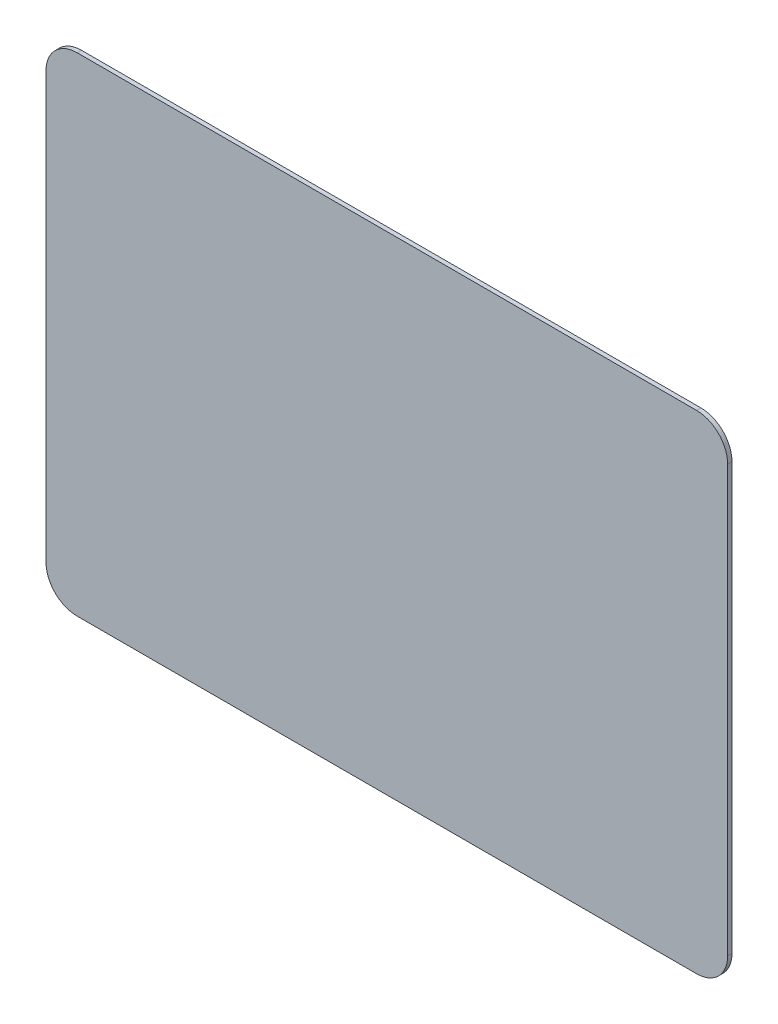
ISO-10303-21;
HEADER;
FILE_DESCRIPTION(('STEP AP214'),'2;1');
FILE_NAME('part.step','',(''),(''),'','','');
FILE_SCHEMA(('AUTOMOTIVE_DESIGN { 1 0 10303 214 1 1 1 1 }'));
ENDSEC;
DATA;
#1=APPLICATION_CONTEXT('core data for automotive mechanical design processes');
#2=APPLICATION_PROTOCOL_DEFINITION('international standard','automotive_design',2000,#1);
#3=PRODUCT_CONTEXT('',#1,'mechanical');
#4=PRODUCT('Part','Part','',(#3));
#5=PRODUCT_RELATED_PRODUCT_CATEGORY('part','',(#4));
#6=PRODUCT_DEFINITION_FORMATION('','',#4);
#7=PRODUCT_DEFINITION_CONTEXT('part definition',#1,'design');
#8=PRODUCT_DEFINITION('design','',#6,#7);
#9=PRODUCT_DEFINITION_SHAPE('','',#8);
#10=(LENGTH_UNIT() NAMED_UNIT(*) SI_UNIT(.MILLI.,.METRE.));
#11=(NAMED_UNIT(*) PLANE_ANGLE_UNIT() SI_UNIT($,.RADIAN.));
#12=(NAMED_UNIT(*) SI_UNIT($,.STERADIAN.) SOLID_ANGLE_UNIT());
#13=UNCERTAINTY_MEASURE_WITH_UNIT(LENGTH_MEASURE(1.E-05),#10,'distance_accuracy_value','');
#14=(GEOMETRIC_REPRESENTATION_CONTEXT(3) GLOBAL_UNCERTAINTY_ASSIGNED_CONTEXT((#13)) GLOBAL_UNIT_ASSIGNED_CONTEXT((#10,
#11,#12)) REPRESENTATION_CONTEXT('',''));
#15=CARTESIAN_POINT('',(0.,0.,0.));
#16=DIRECTION('',(0.,0.,1.));
#17=DIRECTION('',(1.,0.,0.));
#18=AXIS2_PLACEMENT_3D('',#15,#16,#17);
#19=CARTESIAN_POINT('',(-177.403473857814,-128.60424043732,2.286));
#20=DIRECTION('',(0.,0.,-1.));
#21=DIRECTION('',(-1.,0.,0.));
#22=AXIS2_PLACEMENT_3D('',#19,#20,#21);
#23=CYLINDRICAL_SURFACE('',#22,16.51);
#24=CARTESIAN_POINT('',(-177.403473857814,-128.60424043732,0.));
#25=DIRECTION('',(0.,0.,1.));
#26=DIRECTION('',(1.,0.,0.));
#27=AXIS2_PLACEMENT_3D('',#24,#25,#26);
#28=CIRCLE('',#27,16.51);
#29=CARTESIAN_POINT('',(-193.913473857814,-128.60424043732,0.));
#30=VERTEX_POINT('',#29);
#31=CARTESIAN_POINT('',(-177.403473857814,-145.11424043732,0.));
#32=VERTEX_POINT('',#31);
#33=EDGE_CURVE('E131',#30,#32,#28,.T.);
#34=ORIENTED_EDGE('',*,*,#33,.T.);
#35=DIRECTION('',(0.,0.,-1.));
#36=VECTOR('',#35,1.);
#37=CARTESIAN_POINT('',(-177.403473857814,-145.11424043732,2.286));
#38=LINE('',#37,#36);
#39=CARTESIAN_POINT('',(-177.403473857814,-145.11424043732,2.286));
#40=VERTEX_POINT('',#39);
#41=EDGE_CURVE('E11',#40,#32,#38,.T.);
#42=ORIENTED_EDGE('',*,*,#41,.F.);
#43=CARTESIAN_POINT('',(-177.403473857814,-128.60424043732,2.286));
#44=DIRECTION('',(0.,0.,1.));
#45=DIRECTION('',(1.,0.,0.));
#46=AXIS2_PLACEMENT_3D('',#43,#44,#45);
#47=CIRCLE('',#46,16.51);
#48=CARTESIAN_POINT('',(-193.913473857814,-128.60424043732,2.286));
#49=VERTEX_POINT('',#48);
#50=EDGE_CURVE('E145',#49,#40,#47,.T.);
#51=ORIENTED_EDGE('',*,*,#50,.F.);
#52=DIRECTION('',(0.,0.,-1.));
#53=VECTOR('',#52,1.);
#54=CARTESIAN_POINT('',(-193.913473857814,-128.60424043732,2.286));
#55=LINE('',#54,#53);
#56=EDGE_CURVE('E127',#49,#30,#55,.T.);
#57=ORIENTED_EDGE('',*,*,#56,.T.);
#58=EDGE_LOOP('',(#34,#42,#51,#57));
#59=FACE_BOUND('',#58,.T.);
#60=ADVANCED_FACE('F35',(#59),#23,.T.);
#61=CARTESIAN_POINT('',(-177.403473857814,-145.11424043732,2.286));
#62=DIRECTION('',(0.,1.,0.));
#63=DIRECTION('',(0.,0.,1.));
#64=AXIS2_PLACEMENT_3D('',#61,#62,#63);
#65=PLANE('',#64);
#66=DIRECTION('',(1.,0.,0.));
#67=VECTOR('',#66,1.);
#68=CARTESIAN_POINT('',(-177.403473857814,-145.11424043732,0.));
#69=LINE('',#68,#67);
#70=CARTESIAN_POINT('',(151.526526142186,-145.11424043732,0.));
#71=VERTEX_POINT('',#70);
#72=EDGE_CURVE('E134',#32,#71,#69,.T.);
#73=ORIENTED_EDGE('',*,*,#72,.T.);
#74=DIRECTION('',(0.,0.,-1.));
#75=VECTOR('',#74,1.);
#76=CARTESIAN_POINT('',(151.526526142186,-145.11424043732,2.286));
#77=LINE('',#76,#75);
#78=CARTESIAN_POINT('',(151.526526142186,-145.11424043732,2.286));
#79=VERTEX_POINT('',#78);
#80=EDGE_CURVE('E43',#79,#71,#77,.T.);
#81=ORIENTED_EDGE('',*,*,#80,.F.);
#82=DIRECTION('',(1.,0.,0.));
#83=VECTOR('',#82,1.);
#84=CARTESIAN_POINT('',(-177.403473857814,-145.11424043732,2.286));
#85=LINE('',#84,#83);
#86=EDGE_CURVE('E94',#40,#79,#85,.T.);
#87=ORIENTED_EDGE('',*,*,#86,.F.);
#88=ORIENTED_EDGE('',*,*,#41,.T.);
#89=EDGE_LOOP('',(#73,#81,#87,#88));
#90=FACE_BOUND('',#89,.T.);
#91=ADVANCED_FACE('F180',(#90),#65,.F.);
#92=CARTESIAN_POINT('',(151.526526142186,-128.60424043732,2.286));
#93=DIRECTION('',(0.,0.,-1.));
#94=DIRECTION('',(-1.,0.,0.));
#95=AXIS2_PLACEMENT_3D('',#92,#93,#94);
#96=CYLINDRICAL_SURFACE('',#95,16.51);
#97=CARTESIAN_POINT('',(151.526526142186,-128.60424043732,0.));
#98=DIRECTION('',(0.,0.,1.));
#99=DIRECTION('',(1.,0.,0.));
#100=AXIS2_PLACEMENT_3D('',#97,#98,#99);
#101=CIRCLE('',#100,16.51);
#102=CARTESIAN_POINT('',(168.036526142186,-128.60424043732,0.));
#103=VERTEX_POINT('',#102);
#104=EDGE_CURVE('E136',#71,#103,#101,.T.);
#105=ORIENTED_EDGE('',*,*,#104,.T.);
#106=DIRECTION('',(0.,0.,-1.));
#107=VECTOR('',#106,1.);
#108=CARTESIAN_POINT('',(168.036526142186,-128.60424043732,2.286));
#109=LINE('',#108,#107);
#110=CARTESIAN_POINT('',(168.036526142186,-128.60424043732,2.286));
#111=VERTEX_POINT('',#110);
#112=EDGE_CURVE('E152',#111,#103,#109,.T.);
#113=ORIENTED_EDGE('',*,*,#112,.F.);
#114=CARTESIAN_POINT('',(151.526526142186,-128.60424043732,2.286));
#115=DIRECTION('',(0.,0.,1.));
#116=DIRECTION('',(1.,0.,0.));
#117=AXIS2_PLACEMENT_3D('',#114,#115,#116);
#118=CIRCLE('',#117,16.51);
#119=EDGE_CURVE('E160',#79,#111,#118,.T.);
#120=ORIENTED_EDGE('',*,*,#119,.F.);
#121=ORIENTED_EDGE('',*,*,#80,.T.);
#122=EDGE_LOOP('',(#105,#113,#120,#121));
#123=FACE_BOUND('',#122,.T.);
#124=ADVANCED_FACE('F158',(#123),#96,.T.);
#125=CARTESIAN_POINT('',(168.036526142186,-128.60424043732,2.286));
#126=DIRECTION('',(-1.,0.,0.));
#127=DIRECTION('',(0.,0.,1.));
#128=AXIS2_PLACEMENT_3D('',#125,#126,#127);
#129=PLANE('',#128);
#130=DIRECTION('',(0.,1.,0.));
#131=VECTOR('',#130,1.);
#132=CARTESIAN_POINT('',(168.036526142186,-128.60424043732,0.));
#133=LINE('',#132,#131);
#134=CARTESIAN_POINT('',(168.036526142186,97.4557595626803,0.));
#135=VERTEX_POINT('',#134);
#136=EDGE_CURVE('E138',#103,#135,#133,.T.);
#137=ORIENTED_EDGE('',*,*,#136,.T.);
#138=DIRECTION('',(0.,0.,-1.));
#139=VECTOR('',#138,1.);
#140=CARTESIAN_POINT('',(168.036526142186,97.4557595626803,2.286));
#141=LINE('',#140,#139);
#142=CARTESIAN_POINT('',(168.036526142186,97.4557595626803,2.286));
#143=VERTEX_POINT('',#142);
#144=EDGE_CURVE('E149',#143,#135,#141,.T.);
#145=ORIENTED_EDGE('',*,*,#144,.F.);
#146=DIRECTION('',(0.,1.,0.));
#147=VECTOR('',#146,1.);
#148=CARTESIAN_POINT('',(168.036526142186,-128.60424043732,2.286));
#149=LINE('',#148,#147);
#150=EDGE_CURVE('E172',#111,#143,#149,.T.);
#151=ORIENTED_EDGE('',*,*,#150,.F.);
#152=ORIENTED_EDGE('',*,*,#112,.T.);
#153=EDGE_LOOP('',(#137,#145,#151,#152));
#154=FACE_BOUND('',#153,.T.);
#155=ADVANCED_FACE('F168',(#154),#129,.F.);
#156=CARTESIAN_POINT('',(151.526526142186,97.4557595626803,2.286));
#157=DIRECTION('',(0.,0.,-1.));
#158=DIRECTION('',(-1.,0.,0.));
#159=AXIS2_PLACEMENT_3D('',#156,#157,#158);
#160=CYLINDRICAL_SURFACE('',#159,16.51);
#161=CARTESIAN_POINT('',(151.526526142186,97.4557595626803,0.));
#162=DIRECTION('',(0.,0.,1.));
#163=DIRECTION('',(1.,0.,0.));
#164=AXIS2_PLACEMENT_3D('',#161,#162,#163);
#165=CIRCLE('',#164,16.51);
#166=CARTESIAN_POINT('',(151.526526142186,113.96575956268,0.));
#167=VERTEX_POINT('',#166);
#168=EDGE_CURVE('E140',#135,#167,#165,.T.);
#169=ORIENTED_EDGE('',*,*,#168,.T.);
#170=DIRECTION('',(0.,0.,-1.));
#171=VECTOR('',#170,1.);
#172=CARTESIAN_POINT('',(151.526526142186,113.96575956268,2.286));
#173=LINE('',#172,#171);
#174=CARTESIAN_POINT('',(151.526526142186,113.96575956268,2.286));
#175=VERTEX_POINT('',#174);
#176=EDGE_CURVE('E122',#175,#167,#173,.T.);
#177=ORIENTED_EDGE('',*,*,#176,.F.);
#178=CARTESIAN_POINT('',(151.526526142186,97.4557595626803,2.286));
#179=DIRECTION('',(0.,0.,1.));
#180=DIRECTION('',(1.,0.,0.));
#181=AXIS2_PLACEMENT_3D('',#178,#179,#180);
#182=CIRCLE('',#181,16.51);
#183=EDGE_CURVE('E113',#143,#175,#182,.T.);
#184=ORIENTED_EDGE('',*,*,#183,.F.);
#185=ORIENTED_EDGE('',*,*,#144,.T.);
#186=EDGE_LOOP('',(#169,#177,#184,#185));
#187=FACE_BOUND('',#186,.T.);
#188=ADVANCED_FACE('F171',(#187),#160,.T.);
#189=CARTESIAN_POINT('',(-177.403473857814,113.96575956268,2.286));
#190=DIRECTION('',(0.,-1.,0.));
#191=DIRECTION('',(0.,0.,-1.));
#192=AXIS2_PLACEMENT_3D('',#189,#190,#191);
#193=PLANE('',#192);
#194=DIRECTION('',(-1.,0.,0.));
#195=VECTOR('',#194,1.);
#196=CARTESIAN_POINT('',(-177.403473857814,113.96575956268,0.));
#197=LINE('',#196,#195);
#198=CARTESIAN_POINT('',(-177.403473857814,113.96575956268,0.));
#199=VERTEX_POINT('',#198);
#200=EDGE_CURVE('E121',#167,#199,#197,.T.);
#201=ORIENTED_EDGE('',*,*,#200,.T.);
#202=DIRECTION('',(0.,0.,-1.));
#203=VECTOR('',#202,1.);
#204=CARTESIAN_POINT('',(-177.403473857814,113.96575956268,2.286));
#205=LINE('',#204,#203);
#206=CARTESIAN_POINT('',(-177.403473857814,113.96575956268,2.286));
#207=VERTEX_POINT('',#206);
#208=EDGE_CURVE('E118',#207,#199,#205,.T.);
#209=ORIENTED_EDGE('',*,*,#208,.F.);
#210=DIRECTION('',(-1.,0.,0.));
#211=VECTOR('',#210,1.);
#212=CARTESIAN_POINT('',(-177.403473857814,113.96575956268,2.286));
#213=LINE('',#212,#211);
#214=EDGE_CURVE('E107',#175,#207,#213,.T.);
#215=ORIENTED_EDGE('',*,*,#214,.F.);
#216=ORIENTED_EDGE('',*,*,#176,.T.);
#217=EDGE_LOOP('',(#201,#209,#215,#216));
#218=FACE_BOUND('',#217,.T.);
#219=ADVANCED_FACE('F119',(#218),#193,.F.);
#220=CARTESIAN_POINT('',(-177.403473857814,97.4557595626803,2.286));
#221=DIRECTION('',(0.,0.,-1.));
#222=DIRECTION('',(-1.,0.,0.));
#223=AXIS2_PLACEMENT_3D('',#220,#221,#222);
#224=CYLINDRICAL_SURFACE('',#223,16.51);
#225=CARTESIAN_POINT('',(-177.403473857814,97.4557595626803,0.));
#226=DIRECTION('',(0.,0.,1.));
#227=DIRECTION('',(1.,0.,0.));
#228=AXIS2_PLACEMENT_3D('',#225,#226,#227);
#229=CIRCLE('',#228,16.51);
#230=CARTESIAN_POINT('',(-193.913473857814,97.4557595626803,0.));
#231=VERTEX_POINT('',#230);
#232=EDGE_CURVE('E80',#199,#231,#229,.T.);
#233=ORIENTED_EDGE('',*,*,#232,.T.);
#234=DIRECTION('',(0.,0.,-1.));
#235=VECTOR('',#234,1.);
#236=CARTESIAN_POINT('',(-193.913473857814,97.4557595626803,2.286));
#237=LINE('',#236,#235);
#238=CARTESIAN_POINT('',(-193.913473857814,97.4557595626803,2.286));
#239=VERTEX_POINT('',#238);
#240=EDGE_CURVE('E123',#239,#231,#237,.T.);
#241=ORIENTED_EDGE('',*,*,#240,.F.);
#242=CARTESIAN_POINT('',(-177.403473857814,97.4557595626803,2.286));
#243=DIRECTION('',(0.,0.,1.));
#244=DIRECTION('',(1.,0.,0.));
#245=AXIS2_PLACEMENT_3D('',#242,#243,#244);
#246=CIRCLE('',#245,16.51);
#247=EDGE_CURVE('E111',#207,#239,#246,.T.);
#248=ORIENTED_EDGE('',*,*,#247,.F.);
#249=ORIENTED_EDGE('',*,*,#208,.T.);
#250=EDGE_LOOP('',(#233,#241,#248,#249));
#251=FACE_BOUND('',#250,.T.);
#252=ADVANCED_FACE('F125',(#251),#224,.T.);
#253=CARTESIAN_POINT('',(-193.913473857814,-128.60424043732,2.286));
#254=DIRECTION('',(1.,0.,0.));
#255=DIRECTION('',(0.,0.,-1.));
#256=AXIS2_PLACEMENT_3D('',#253,#254,#255);
#257=PLANE('',#256);
#258=DIRECTION('',(0.,-1.,0.));
#259=VECTOR('',#258,1.);
#260=CARTESIAN_POINT('',(-193.913473857814,-128.60424043732,0.));
#261=LINE('',#260,#259);
#262=EDGE_CURVE('E86',#231,#30,#261,.T.);
#263=ORIENTED_EDGE('',*,*,#262,.T.);
#264=ORIENTED_EDGE('',*,*,#56,.F.);
#265=DIRECTION('',(0.,-1.,0.));
#266=VECTOR('',#265,1.);
#267=CARTESIAN_POINT('',(-193.913473857814,-128.60424043732,2.286));
#268=LINE('',#267,#266);
#269=EDGE_CURVE('E51',#239,#49,#268,.T.);
#270=ORIENTED_EDGE('',*,*,#269,.F.);
#271=ORIENTED_EDGE('',*,*,#240,.T.);
#272=EDGE_LOOP('',(#263,#264,#270,#271));
#273=FACE_BOUND('',#272,.T.);
#274=ADVANCED_FACE('F196',(#273),#257,.F.);
#275=CARTESIAN_POINT('',(-177.403473857814,-128.60424043732,2.286));
#276=DIRECTION('',(0.,0.,1.));
#277=DIRECTION('',(1.,0.,0.));
#278=AXIS2_PLACEMENT_3D('',#275,#276,#277);
#279=PLANE('',#278);
#280=ORIENTED_EDGE('',*,*,#50,.T.);
#281=ORIENTED_EDGE('',*,*,#86,.T.);
#282=ORIENTED_EDGE('',*,*,#119,.T.);
#283=ORIENTED_EDGE('',*,*,#150,.T.);
#284=ORIENTED_EDGE('',*,*,#183,.T.);
#285=ORIENTED_EDGE('',*,*,#214,.T.);
#286=ORIENTED_EDGE('',*,*,#247,.T.);
#287=ORIENTED_EDGE('',*,*,#269,.T.);
#288=EDGE_LOOP('',(#280,#281,#282,#283,#284,#285,#286,#287));
#289=FACE_BOUND('',#288,.T.);
#290=ADVANCED_FACE('F109',(#289),#279,.T.);
#291=CARTESIAN_POINT('',(-177.403473857814,-128.60424043732,0.));
#292=DIRECTION('',(0.,0.,1.));
#293=DIRECTION('',(1.,0.,0.));
#294=AXIS2_PLACEMENT_3D('',#291,#292,#293);
#295=PLANE('',#294);
#296=ORIENTED_EDGE('',*,*,#33,.F.);
#297=ORIENTED_EDGE('',*,*,#262,.F.);
#298=ORIENTED_EDGE('',*,*,#232,.F.);
#299=ORIENTED_EDGE('',*,*,#200,.F.);
#300=ORIENTED_EDGE('',*,*,#168,.F.);
#301=ORIENTED_EDGE('',*,*,#136,.F.);
#302=ORIENTED_EDGE('',*,*,#104,.F.);
#303=ORIENTED_EDGE('',*,*,#72,.F.);
#304=EDGE_LOOP('',(#296,#297,#298,#299,#300,#301,#302,#303));
#305=FACE_BOUND('',#304,.T.);
#306=ADVANCED_FACE('F164',(#305),#295,.F.);
#307=CLOSED_SHELL('',(#60,#91,#124,#155,#188,#219,#252,#274,#290,#306));
#308=MANIFOLD_SOLID_BREP('B2',#307);
#309=ADVANCED_BREP_SHAPE_REPRESENTATION('',(#18,#308),#14);
#310=SHAPE_DEFINITION_REPRESENTATION(#9,#309);
ENDSEC;
END-ISO-10303-21;
